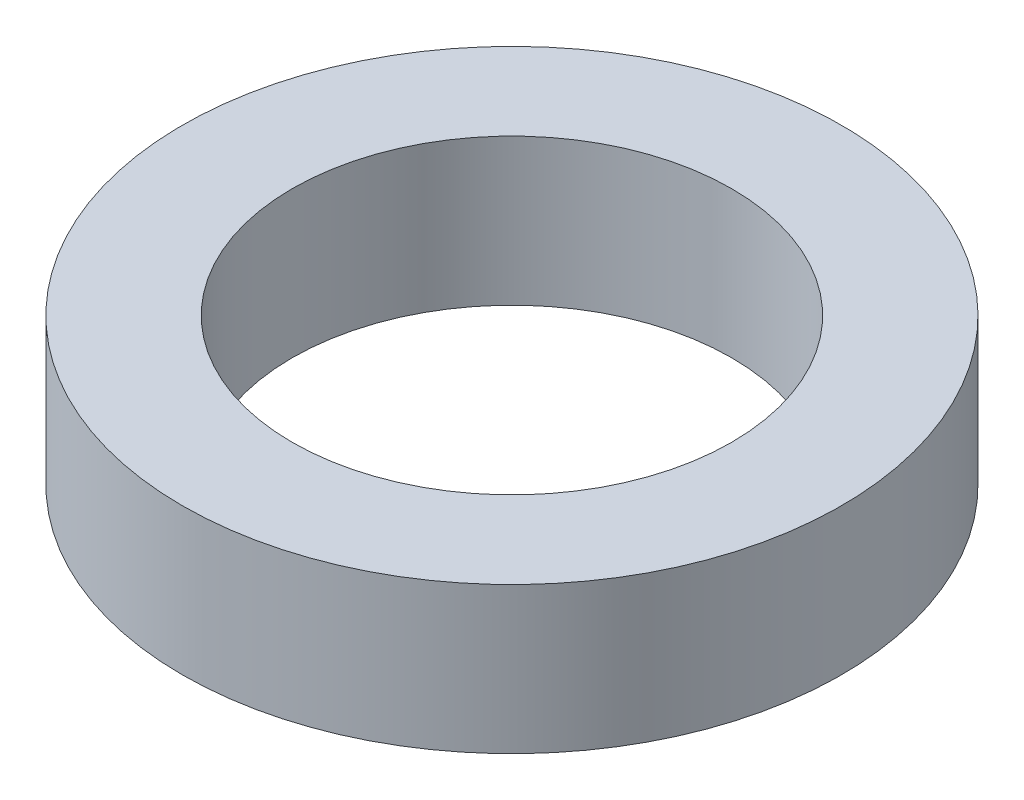
ISO-10303-21;
HEADER;
FILE_DESCRIPTION(('STEP AP214'),'2;1');
FILE_NAME('part.step','',(''),(''),'','','');
FILE_SCHEMA(('AUTOMOTIVE_DESIGN { 1 0 10303 214 1 1 1 1 }'));
ENDSEC;
DATA;
#1=APPLICATION_CONTEXT('core data for automotive mechanical design processes');
#2=APPLICATION_PROTOCOL_DEFINITION('international standard','automotive_design',2000,#1);
#3=PRODUCT_CONTEXT('',#1,'mechanical');
#4=PRODUCT('Part','Part','',(#3));
#5=PRODUCT_RELATED_PRODUCT_CATEGORY('part','',(#4));
#6=PRODUCT_DEFINITION_FORMATION('','',#4);
#7=PRODUCT_DEFINITION_CONTEXT('part definition',#1,'design');
#8=PRODUCT_DEFINITION('design','',#6,#7);
#9=PRODUCT_DEFINITION_SHAPE('','',#8);
#10=(LENGTH_UNIT() NAMED_UNIT(*) SI_UNIT(.MILLI.,.METRE.));
#11=(NAMED_UNIT(*) PLANE_ANGLE_UNIT() SI_UNIT($,.RADIAN.));
#12=(NAMED_UNIT(*) SI_UNIT($,.STERADIAN.) SOLID_ANGLE_UNIT());
#13=UNCERTAINTY_MEASURE_WITH_UNIT(LENGTH_MEASURE(1.E-05),#10,'distance_accuracy_value','');
#14=(GEOMETRIC_REPRESENTATION_CONTEXT(3) GLOBAL_UNCERTAINTY_ASSIGNED_CONTEXT((#13)) GLOBAL_UNIT_ASSIGNED_CONTEXT((#10,
#11,#12)) REPRESENTATION_CONTEXT('',''));
#15=CARTESIAN_POINT('',(0.,0.,0.));
#16=DIRECTION('',(0.,0.,1.));
#17=DIRECTION('',(1.,0.,0.));
#18=AXIS2_PLACEMENT_3D('',#15,#16,#17);
#19=CARTESIAN_POINT('',(0.,4.,0.));
#20=DIRECTION('',(0.,1.,0.));
#21=DIRECTION('',(0.,0.,1.));
#22=AXIS2_PLACEMENT_3D('',#19,#20,#21);
#23=PLANE('',#22);
#24=CARTESIAN_POINT('',(0.,4.,0.));
#25=DIRECTION('',(0.,1.,0.));
#26=DIRECTION('',(0.,0.,1.));
#27=AXIS2_PLACEMENT_3D('',#24,#25,#26);
#28=CIRCLE('',#27,9.);
#29=CARTESIAN_POINT('',(0.,4.,9.));
#30=VERTEX_POINT('',#29);
#31=EDGE_CURVE('E10',#30,#30,#28,.T.);
#32=ORIENTED_EDGE('',*,*,#31,.T.);
#33=EDGE_LOOP('',(#32));
#34=FACE_BOUND('',#33,.T.);
#35=CARTESIAN_POINT('',(0.,4.,0.));
#36=DIRECTION('',(0.,1.,0.));
#37=DIRECTION('',(0.,0.,1.));
#38=AXIS2_PLACEMENT_3D('',#35,#36,#37);
#39=CIRCLE('',#38,6.);
#40=CARTESIAN_POINT('',(0.,4.,6.));
#41=VERTEX_POINT('',#40);
#42=EDGE_CURVE('E57',#41,#41,#39,.T.);
#43=ORIENTED_EDGE('',*,*,#42,.F.);
#44=EDGE_LOOP('',(#43));
#45=FACE_BOUND('',#44,.T.);
#46=ADVANCED_FACE('F43',(#34,#45),#23,.T.);
#47=CARTESIAN_POINT('',(0.,0.,0.));
#48=DIRECTION('',(0.,1.,0.));
#49=DIRECTION('',(0.,0.,1.));
#50=AXIS2_PLACEMENT_3D('',#47,#48,#49);
#51=PLANE('',#50);
#52=CARTESIAN_POINT('',(0.,0.,0.));
#53=DIRECTION('',(0.,1.,0.));
#54=DIRECTION('',(0.,0.,1.));
#55=AXIS2_PLACEMENT_3D('',#52,#53,#54);
#56=CIRCLE('',#55,9.);
#57=CARTESIAN_POINT('',(0.,0.,9.));
#58=VERTEX_POINT('',#57);
#59=EDGE_CURVE('E50',#58,#58,#56,.T.);
#60=ORIENTED_EDGE('',*,*,#59,.F.);
#61=EDGE_LOOP('',(#60));
#62=FACE_BOUND('',#61,.T.);
#63=CARTESIAN_POINT('',(0.,0.,0.));
#64=DIRECTION('',(0.,1.,0.));
#65=DIRECTION('',(0.,0.,1.));
#66=AXIS2_PLACEMENT_3D('',#63,#64,#65);
#67=CIRCLE('',#66,6.);
#68=CARTESIAN_POINT('',(0.,0.,6.));
#69=VERTEX_POINT('',#68);
#70=EDGE_CURVE('E59',#69,#69,#67,.T.);
#71=ORIENTED_EDGE('',*,*,#70,.T.);
#72=EDGE_LOOP('',(#71));
#73=FACE_BOUND('',#72,.T.);
#74=ADVANCED_FACE('F68',(#62,#73),#51,.F.);
#75=CARTESIAN_POINT('',(0.,4.,0.));
#76=DIRECTION('',(0.,-1.,0.));
#77=DIRECTION('',(0.,0.,-1.));
#78=AXIS2_PLACEMENT_3D('',#75,#76,#77);
#79=CYLINDRICAL_SURFACE('',#78,9.);
#80=ORIENTED_EDGE('',*,*,#31,.F.);
#81=EDGE_LOOP('',(#80));
#82=FACE_BOUND('',#81,.T.);
#83=ORIENTED_EDGE('',*,*,#59,.T.);
#84=EDGE_LOOP('',(#83));
#85=FACE_BOUND('',#84,.T.);
#86=ADVANCED_FACE('F44',(#82,#85),#79,.T.);
#87=CARTESIAN_POINT('',(0.,4.,0.));
#88=DIRECTION('',(0.,-1.,0.));
#89=DIRECTION('',(0.,0.,-1.));
#90=AXIS2_PLACEMENT_3D('',#87,#88,#89);
#91=CYLINDRICAL_SURFACE('',#90,6.);
#92=ORIENTED_EDGE('',*,*,#42,.T.);
#93=EDGE_LOOP('',(#92));
#94=FACE_BOUND('',#93,.T.);
#95=ORIENTED_EDGE('',*,*,#70,.F.);
#96=EDGE_LOOP('',(#95));
#97=FACE_BOUND('',#96,.T.);
#98=ADVANCED_FACE('F67',(#94,#97),#91,.F.);
#99=CLOSED_SHELL('',(#46,#74,#86,#98));
#100=MANIFOLD_SOLID_BREP('B2',#99);
#101=ADVANCED_BREP_SHAPE_REPRESENTATION('',(#18,#100),#14);
#102=SHAPE_DEFINITION_REPRESENTATION(#9,#101);
ENDSEC;
END-ISO-10303-21;
